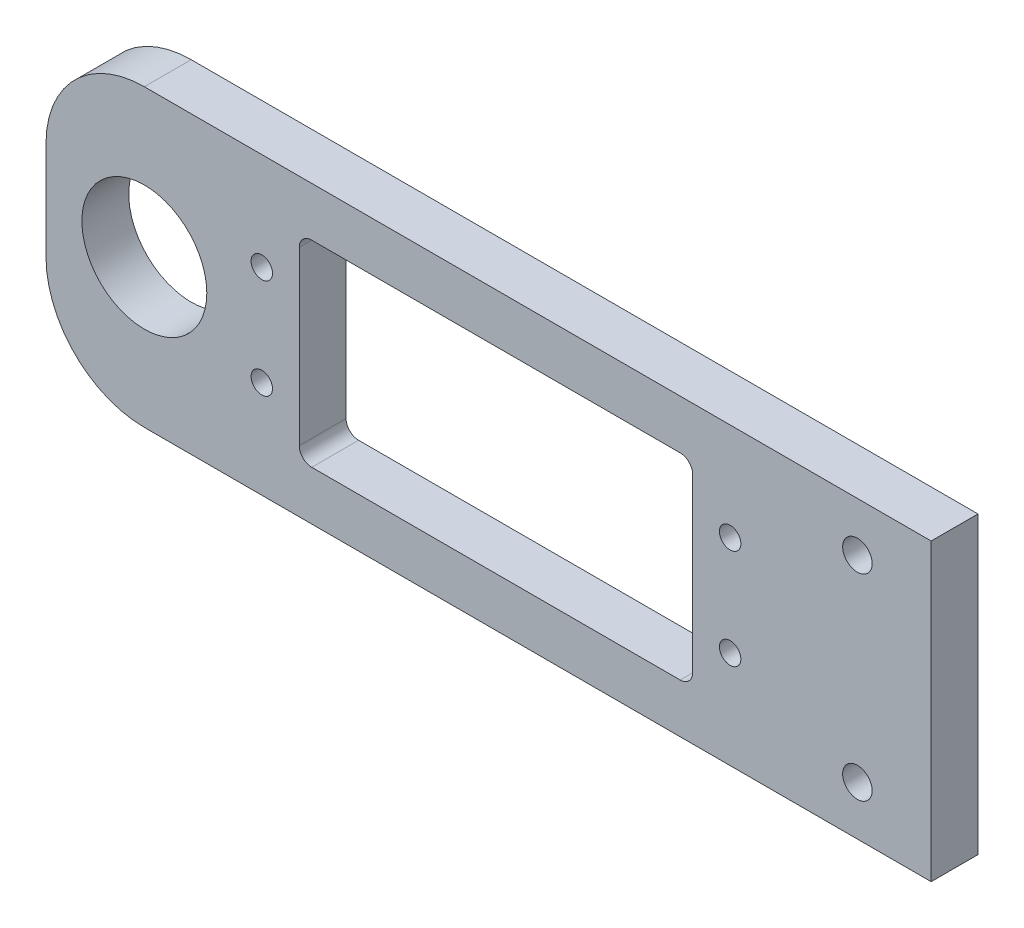
ISO-10303-21;
HEADER;
FILE_DESCRIPTION(('STEP AP214'),'2;1');
FILE_NAME('part.step','',(''),(''),'','','');
FILE_SCHEMA(('AUTOMOTIVE_DESIGN { 1 0 10303 214 1 1 1 1 }'));
ENDSEC;
DATA;
#1=APPLICATION_CONTEXT('core data for automotive mechanical design processes');
#2=APPLICATION_PROTOCOL_DEFINITION('international standard','automotive_design',2000,#1);
#3=PRODUCT_CONTEXT('',#1,'mechanical');
#4=PRODUCT('Part','Part','',(#3));
#5=PRODUCT_RELATED_PRODUCT_CATEGORY('part','',(#4));
#6=PRODUCT_DEFINITION_FORMATION('','',#4);
#7=PRODUCT_DEFINITION_CONTEXT('part definition',#1,'design');
#8=PRODUCT_DEFINITION('design','',#6,#7);
#9=PRODUCT_DEFINITION_SHAPE('','',#8);
#10=(LENGTH_UNIT() NAMED_UNIT(*) SI_UNIT(.MILLI.,.METRE.));
#11=(NAMED_UNIT(*) PLANE_ANGLE_UNIT() SI_UNIT($,.RADIAN.));
#12=(NAMED_UNIT(*) SI_UNIT($,.STERADIAN.) SOLID_ANGLE_UNIT());
#13=UNCERTAINTY_MEASURE_WITH_UNIT(LENGTH_MEASURE(1.E-05),#10,'distance_accuracy_value','');
#14=(GEOMETRIC_REPRESENTATION_CONTEXT(3) GLOBAL_UNCERTAINTY_ASSIGNED_CONTEXT((#13)) GLOBAL_UNIT_ASSIGNED_CONTEXT((#10,
#11,#12)) REPRESENTATION_CONTEXT('',''));
#15=CARTESIAN_POINT('',(0.,0.,0.));
#16=DIRECTION('',(0.,0.,1.));
#17=DIRECTION('',(1.,0.,0.));
#18=AXIS2_PLACEMENT_3D('',#15,#16,#17);
#19=CARTESIAN_POINT('',(45.,15.,4.7625));
#20=DIRECTION('',(-1.,0.,0.));
#21=DIRECTION('',(0.,-1.,0.));
#22=AXIS2_PLACEMENT_3D('',#19,#20,#21);
#23=PLANE('',#22);
#24=DIRECTION('',(0.,1.,0.));
#25=VECTOR('',#24,1.);
#26=CARTESIAN_POINT('',(45.,15.,0.));
#27=LINE('',#26,#25);
#28=CARTESIAN_POINT('',(45.,-15.,0.));
#29=VERTEX_POINT('',#28);
#30=CARTESIAN_POINT('',(45.,15.,0.));
#31=VERTEX_POINT('',#30);
#32=EDGE_CURVE('E161',#29,#31,#27,.T.);
#33=ORIENTED_EDGE('',*,*,#32,.T.);
#34=DIRECTION('',(0.,0.,-1.));
#35=VECTOR('',#34,1.);
#36=CARTESIAN_POINT('',(45.,15.,4.7625));
#37=LINE('',#36,#35);
#38=CARTESIAN_POINT('',(45.,15.,4.7625));
#39=VERTEX_POINT('',#38);
#40=EDGE_CURVE('E141',#39,#31,#37,.T.);
#41=ORIENTED_EDGE('',*,*,#40,.F.);
#42=DIRECTION('',(0.,1.,0.));
#43=VECTOR('',#42,1.);
#44=CARTESIAN_POINT('',(45.,15.,4.7625));
#45=LINE('',#44,#43);
#46=CARTESIAN_POINT('',(45.,-15.,4.7625));
#47=VERTEX_POINT('',#46);
#48=EDGE_CURVE('E148',#47,#39,#45,.T.);
#49=ORIENTED_EDGE('',*,*,#48,.F.);
#50=DIRECTION('',(0.,0.,-1.));
#51=VECTOR('',#50,1.);
#52=CARTESIAN_POINT('',(45.,-15.,4.7625));
#53=LINE('',#52,#51);
#54=EDGE_CURVE('E163',#47,#29,#53,.T.);
#55=ORIENTED_EDGE('',*,*,#54,.T.);
#56=EDGE_LOOP('',(#33,#41,#49,#55));
#57=FACE_BOUND('',#56,.T.);
#58=ADVANCED_FACE('F35',(#57),#23,.F.);
#59=CARTESIAN_POINT('',(-45.,15.,4.7625));
#60=DIRECTION('',(0.,-1.,0.));
#61=DIRECTION('',(0.,0.,-1.));
#62=AXIS2_PLACEMENT_3D('',#59,#60,#61);
#63=PLANE('',#62);
#64=DIRECTION('',(-1.,0.,0.));
#65=VECTOR('',#64,1.);
#66=CARTESIAN_POINT('',(-45.,15.,0.));
#67=LINE('',#66,#65);
#68=CARTESIAN_POINT('',(-35.,15.,0.));
#69=VERTEX_POINT('',#68);
#70=EDGE_CURVE('E306',#31,#69,#67,.T.);
#71=ORIENTED_EDGE('',*,*,#70,.T.);
#72=DIRECTION('',(0.,0.,-1.));
#73=VECTOR('',#72,1.);
#74=CARTESIAN_POINT('',(-35.,15.,4.7625));
#75=LINE('',#74,#73);
#76=CARTESIAN_POINT('',(-35.,15.,4.7625));
#77=VERTEX_POINT('',#76);
#78=EDGE_CURVE('E144',#69,#77,#75,.F.);
#79=ORIENTED_EDGE('',*,*,#78,.T.);
#80=DIRECTION('',(-1.,0.,0.));
#81=VECTOR('',#80,1.);
#82=CARTESIAN_POINT('',(-45.,15.,4.7625));
#83=LINE('',#82,#81);
#84=EDGE_CURVE('E136',#39,#77,#83,.T.);
#85=ORIENTED_EDGE('',*,*,#84,.F.);
#86=ORIENTED_EDGE('',*,*,#40,.T.);
#87=EDGE_LOOP('',(#71,#79,#85,#86));
#88=FACE_BOUND('',#87,.T.);
#89=ADVANCED_FACE('F139',(#88),#63,.F.);
#90=CARTESIAN_POINT('',(-45.,15.,4.7625));
#91=DIRECTION('',(1.,0.,0.));
#92=DIRECTION('',(0.,0.,-1.));
#93=AXIS2_PLACEMENT_3D('',#90,#91,#92);
#94=PLANE('',#93);
#95=DIRECTION('',(0.,-1.,0.));
#96=VECTOR('',#95,1.);
#97=CARTESIAN_POINT('',(-45.,15.,0.));
#98=LINE('',#97,#96);
#99=CARTESIAN_POINT('',(-45.,5.,0.));
#100=VERTEX_POINT('',#99);
#101=CARTESIAN_POINT('',(-45.,-5.,0.));
#102=VERTEX_POINT('',#101);
#103=EDGE_CURVE('E308',#100,#102,#98,.T.);
#104=ORIENTED_EDGE('',*,*,#103,.T.);
#105=DIRECTION('',(0.,0.,-1.));
#106=VECTOR('',#105,1.);
#107=CARTESIAN_POINT('',(-45.,-5.,4.7625));
#108=LINE('',#107,#106);
#109=CARTESIAN_POINT('',(-45.,-5.,4.7625));
#110=VERTEX_POINT('',#109);
#111=EDGE_CURVE('E177',#102,#110,#108,.F.);
#112=ORIENTED_EDGE('',*,*,#111,.T.);
#113=DIRECTION('',(0.,-1.,0.));
#114=VECTOR('',#113,1.);
#115=CARTESIAN_POINT('',(-45.,15.,4.7625));
#116=LINE('',#115,#114);
#117=CARTESIAN_POINT('',(-45.,5.,4.7625));
#118=VERTEX_POINT('',#117);
#119=EDGE_CURVE('E147',#118,#110,#116,.T.);
#120=ORIENTED_EDGE('',*,*,#119,.F.);
#121=DIRECTION('',(0.,0.,-1.));
#122=VECTOR('',#121,1.);
#123=CARTESIAN_POINT('',(-45.,5.,4.7625));
#124=LINE('',#123,#122);
#125=EDGE_CURVE('E174',#118,#100,#124,.T.);
#126=ORIENTED_EDGE('',*,*,#125,.T.);
#127=EDGE_LOOP('',(#104,#112,#120,#126));
#128=FACE_BOUND('',#127,.T.);
#129=ADVANCED_FACE('F250',(#128),#94,.F.);
#130=CARTESIAN_POINT('',(-45.,-15.,4.7625));
#131=DIRECTION('',(0.,1.,0.));
#132=DIRECTION('',(0.,0.,1.));
#133=AXIS2_PLACEMENT_3D('',#130,#131,#132);
#134=PLANE('',#133);
#135=DIRECTION('',(1.,0.,0.));
#136=VECTOR('',#135,1.);
#137=CARTESIAN_POINT('',(-45.,-15.,4.7625));
#138=LINE('',#137,#136);
#139=CARTESIAN_POINT('',(-35.,-15.,4.7625));
#140=VERTEX_POINT('',#139);
#141=EDGE_CURVE('E154',#140,#47,#138,.T.);
#142=ORIENTED_EDGE('',*,*,#141,.F.);
#143=DIRECTION('',(0.,0.,-1.));
#144=VECTOR('',#143,1.);
#145=CARTESIAN_POINT('',(-35.,-15.,4.7625));
#146=LINE('',#145,#144);
#147=CARTESIAN_POINT('',(-35.,-15.,0.));
#148=VERTEX_POINT('',#147);
#149=EDGE_CURVE('E162',#140,#148,#146,.T.);
#150=ORIENTED_EDGE('',*,*,#149,.T.);
#151=DIRECTION('',(1.,0.,0.));
#152=VECTOR('',#151,1.);
#153=CARTESIAN_POINT('',(-45.,-15.,0.));
#154=LINE('',#153,#152);
#155=EDGE_CURVE('E158',#148,#29,#154,.T.);
#156=ORIENTED_EDGE('',*,*,#155,.T.);
#157=ORIENTED_EDGE('',*,*,#54,.F.);
#158=EDGE_LOOP('',(#142,#150,#156,#157));
#159=FACE_BOUND('',#158,.T.);
#160=ADVANCED_FACE('F312',(#159),#134,.F.);
#161=CARTESIAN_POINT('',(0.,0.,4.7625));
#162=DIRECTION('',(0.,0.,1.));
#163=DIRECTION('',(1.,0.,0.));
#164=AXIS2_PLACEMENT_3D('',#161,#162,#163);
#165=PLANE('',#164);
#166=CARTESIAN_POINT('',(37.5,10.,4.7625));
#167=DIRECTION('',(0.,0.,1.));
#168=DIRECTION('',(1.,0.,0.));
#169=AXIS2_PLACEMENT_3D('',#166,#167,#168);
#170=CIRCLE('',#169,1.5);
#171=CARTESIAN_POINT('',(39.,10.,4.7625));
#172=VERTEX_POINT('',#171);
#173=EDGE_CURVE('E371',#172,#172,#170,.T.);
#174=ORIENTED_EDGE('',*,*,#173,.F.);
#175=EDGE_LOOP('',(#174));
#176=FACE_BOUND('',#175,.T.);
#177=CARTESIAN_POINT('',(37.5,-10.,4.7625));
#178=DIRECTION('',(0.,0.,1.));
#179=DIRECTION('',(-1.,0.,0.));
#180=AXIS2_PLACEMENT_3D('',#177,#178,#179);
#181=CIRCLE('',#180,1.5);
#182=CARTESIAN_POINT('',(36.,-10.,4.7625));
#183=VERTEX_POINT('',#182);
#184=EDGE_CURVE('E383',#183,#183,#181,.T.);
#185=ORIENTED_EDGE('',*,*,#184,.F.);
#186=EDGE_LOOP('',(#185));
#187=FACE_BOUND('',#186,.T.);
#188=CARTESIAN_POINT('',(24.56,5.08000000000001,4.7625));
#189=DIRECTION('',(0.,0.,1.));
#190=DIRECTION('',(-1.,0.,0.));
#191=AXIS2_PLACEMENT_3D('',#188,#189,#190);
#192=CIRCLE('',#191,1.09);
#193=CARTESIAN_POINT('',(23.47,5.08000000000001,4.7625));
#194=VERTEX_POINT('',#193);
#195=EDGE_CURVE('E375',#194,#194,#192,.T.);
#196=ORIENTED_EDGE('',*,*,#195,.F.);
#197=EDGE_LOOP('',(#196));
#198=FACE_BOUND('',#197,.T.);
#199=CARTESIAN_POINT('',(24.56,-5.07999999999999,4.7625));
#200=DIRECTION('',(0.,0.,1.));
#201=DIRECTION('',(1.,0.,0.));
#202=AXIS2_PLACEMENT_3D('',#199,#200,#201);
#203=CIRCLE('',#202,1.09);
#204=CARTESIAN_POINT('',(25.65,-5.07999999999999,4.7625));
#205=VERTEX_POINT('',#204);
#206=EDGE_CURVE('E395',#205,#205,#203,.T.);
#207=ORIENTED_EDGE('',*,*,#206,.F.);
#208=EDGE_LOOP('',(#207));
#209=FACE_BOUND('',#208,.T.);
#210=CARTESIAN_POINT('',(-23.06,-5.08,4.7625));
#211=DIRECTION('',(0.,0.,1.));
#212=DIRECTION('',(-1.,0.,0.));
#213=AXIS2_PLACEMENT_3D('',#210,#211,#212);
#214=CIRCLE('',#213,1.09);
#215=CARTESIAN_POINT('',(-24.15,-5.08,4.7625));
#216=VERTEX_POINT('',#215);
#217=EDGE_CURVE('E388',#216,#216,#214,.T.);
#218=ORIENTED_EDGE('',*,*,#217,.F.);
#219=EDGE_LOOP('',(#218));
#220=FACE_BOUND('',#219,.T.);
#221=CARTESIAN_POINT('',(-23.06,5.08,4.7625));
#222=DIRECTION('',(0.,0.,1.));
#223=DIRECTION('',(1.,0.,0.));
#224=AXIS2_PLACEMENT_3D('',#221,#222,#223);
#225=CIRCLE('',#224,1.09);
#226=CARTESIAN_POINT('',(-21.97,5.08,4.7625));
#227=VERTEX_POINT('',#226);
#228=EDGE_CURVE('E284',#227,#227,#225,.T.);
#229=ORIENTED_EDGE('',*,*,#228,.F.);
#230=EDGE_LOOP('',(#229));
#231=FACE_BOUND('',#230,.T.);
#232=DIRECTION('',(0.,-1.,0.));
#233=VECTOR('',#232,1.);
#234=CARTESIAN_POINT('',(-19.25,10.,4.7625));
#235=LINE('',#234,#233);
#236=CARTESIAN_POINT('',(-19.25,8.73,4.7625));
#237=VERTEX_POINT('',#236);
#238=CARTESIAN_POINT('',(-19.25,-8.73,4.7625));
#239=VERTEX_POINT('',#238);
#240=EDGE_CURVE('E290',#237,#239,#235,.T.);
#241=ORIENTED_EDGE('',*,*,#240,.F.);
#242=CARTESIAN_POINT('',(-17.98,8.73,4.7625));
#243=DIRECTION('',(0.,0.,1.));
#244=DIRECTION('',(1.,0.,0.));
#245=AXIS2_PLACEMENT_3D('',#242,#243,#244);
#246=CIRCLE('',#245,1.27);
#247=CARTESIAN_POINT('',(-17.98,10.,4.7625));
#248=VERTEX_POINT('',#247);
#249=EDGE_CURVE('E43',#237,#248,#246,.F.);
#250=ORIENTED_EDGE('',*,*,#249,.T.);
#251=DIRECTION('',(-1.,0.,0.));
#252=VECTOR('',#251,1.);
#253=CARTESIAN_POINT('',(-19.25,10.,4.7625));
#254=LINE('',#253,#252);
#255=CARTESIAN_POINT('',(19.48,10.,4.7625));
#256=VERTEX_POINT('',#255);
#257=EDGE_CURVE('E298',#256,#248,#254,.T.);
#258=ORIENTED_EDGE('',*,*,#257,.F.);
#259=CARTESIAN_POINT('',(19.48,8.73,4.7625));
#260=DIRECTION('',(0.,0.,1.));
#261=DIRECTION('',(1.,0.,0.));
#262=AXIS2_PLACEMENT_3D('',#259,#260,#261);
#263=CIRCLE('',#262,1.27);
#264=CARTESIAN_POINT('',(20.75,8.73,4.7625));
#265=VERTEX_POINT('',#264);
#266=EDGE_CURVE('E57',#256,#265,#263,.F.);
#267=ORIENTED_EDGE('',*,*,#266,.T.);
#268=DIRECTION('',(0.,1.,0.));
#269=VECTOR('',#268,1.);
#270=CARTESIAN_POINT('',(20.75,10.,4.7625));
#271=LINE('',#270,#269);
#272=CARTESIAN_POINT('',(20.75,-8.73,4.7625));
#273=VERTEX_POINT('',#272);
#274=EDGE_CURVE('E296',#273,#265,#271,.T.);
#275=ORIENTED_EDGE('',*,*,#274,.F.);
#276=CARTESIAN_POINT('',(19.48,-8.73,4.7625));
#277=DIRECTION('',(0.,0.,1.));
#278=DIRECTION('',(1.,0.,0.));
#279=AXIS2_PLACEMENT_3D('',#276,#277,#278);
#280=CIRCLE('',#279,1.27);
#281=CARTESIAN_POINT('',(19.48,-10.,4.7625));
#282=VERTEX_POINT('',#281);
#283=EDGE_CURVE('E207',#273,#282,#280,.F.);
#284=ORIENTED_EDGE('',*,*,#283,.T.);
#285=DIRECTION('',(1.,0.,0.));
#286=VECTOR('',#285,1.);
#287=CARTESIAN_POINT('',(-19.25,-10.,4.7625));
#288=LINE('',#287,#286);
#289=CARTESIAN_POINT('',(-17.98,-10.,4.7625));
#290=VERTEX_POINT('',#289);
#291=EDGE_CURVE('E293',#290,#282,#288,.T.);
#292=ORIENTED_EDGE('',*,*,#291,.F.);
#293=CARTESIAN_POINT('',(-17.98,-8.73,4.7625));
#294=DIRECTION('',(0.,0.,1.));
#295=DIRECTION('',(1.,0.,0.));
#296=AXIS2_PLACEMENT_3D('',#293,#294,#295);
#297=CIRCLE('',#296,1.27);
#298=EDGE_CURVE('E211',#290,#239,#297,.F.);
#299=ORIENTED_EDGE('',*,*,#298,.T.);
#300=EDGE_LOOP('',(#241,#250,#258,#267,#275,#284,#292,#299));
#301=FACE_BOUND('',#300,.T.);
#302=CARTESIAN_POINT('',(-35.,0.,4.7625));
#303=DIRECTION('',(0.,0.,1.));
#304=DIRECTION('',(1.,0.,0.));
#305=AXIS2_PLACEMENT_3D('',#302,#303,#304);
#306=CIRCLE('',#305,6.35);
#307=CARTESIAN_POINT('',(-28.65,0.,4.7625));
#308=VERTEX_POINT('',#307);
#309=EDGE_CURVE('E188',#308,#308,#306,.T.);
#310=ORIENTED_EDGE('',*,*,#309,.F.);
#311=EDGE_LOOP('',(#310));
#312=FACE_BOUND('',#311,.T.);
#313=ORIENTED_EDGE('',*,*,#119,.T.);
#314=CARTESIAN_POINT('',(-35.,-5.,4.7625));
#315=DIRECTION('',(0.,0.,1.));
#316=DIRECTION('',(1.,0.,0.));
#317=AXIS2_PLACEMENT_3D('',#314,#315,#316);
#318=CIRCLE('',#317,10.);
#319=EDGE_CURVE('E181',#110,#140,#318,.T.);
#320=ORIENTED_EDGE('',*,*,#319,.T.);
#321=ORIENTED_EDGE('',*,*,#141,.T.);
#322=ORIENTED_EDGE('',*,*,#48,.T.);
#323=ORIENTED_EDGE('',*,*,#84,.T.);
#324=CARTESIAN_POINT('',(-35.,5.,4.7625));
#325=DIRECTION('',(0.,0.,1.));
#326=DIRECTION('',(1.,0.,0.));
#327=AXIS2_PLACEMENT_3D('',#324,#325,#326);
#328=CIRCLE('',#327,10.);
#329=EDGE_CURVE('E179',#77,#118,#328,.T.);
#330=ORIENTED_EDGE('',*,*,#329,.T.);
#331=EDGE_LOOP('',(#313,#320,#321,#322,#323,#330));
#332=FACE_BOUND('',#331,.T.);
#333=ADVANCED_FACE('F152',(#176,#187,#198,#209,#220,#231,#301,#312,#332),#165,.T.);
#334=CARTESIAN_POINT('',(0.,0.,0.));
#335=DIRECTION('',(0.,0.,1.));
#336=DIRECTION('',(1.,0.,0.));
#337=AXIS2_PLACEMENT_3D('',#334,#335,#336);
#338=PLANE('',#337);
#339=CARTESIAN_POINT('',(37.5,10.,0.));
#340=DIRECTION('',(0.,0.,1.));
#341=DIRECTION('',(1.,0.,0.));
#342=AXIS2_PLACEMENT_3D('',#339,#340,#341);
#343=CIRCLE('',#342,1.5);
#344=CARTESIAN_POINT('',(39.,10.,0.));
#345=VERTEX_POINT('',#344);
#346=EDGE_CURVE('E374',#345,#345,#343,.F.);
#347=ORIENTED_EDGE('',*,*,#346,.F.);
#348=EDGE_LOOP('',(#347));
#349=FACE_BOUND('',#348,.T.);
#350=CARTESIAN_POINT('',(37.5,-10.,0.));
#351=DIRECTION('',(0.,0.,1.));
#352=DIRECTION('',(1.,0.,0.));
#353=AXIS2_PLACEMENT_3D('',#350,#351,#352);
#354=CIRCLE('',#353,1.5);
#355=CARTESIAN_POINT('',(39.,-10.,0.));
#356=VERTEX_POINT('',#355);
#357=EDGE_CURVE('E380',#356,#356,#354,.F.);
#358=ORIENTED_EDGE('',*,*,#357,.F.);
#359=EDGE_LOOP('',(#358));
#360=FACE_BOUND('',#359,.T.);
#361=CARTESIAN_POINT('',(24.56,5.08000000000001,0.));
#362=DIRECTION('',(0.,0.,1.));
#363=DIRECTION('',(1.,0.,0.));
#364=AXIS2_PLACEMENT_3D('',#361,#362,#363);
#365=CIRCLE('',#364,1.09);
#366=CARTESIAN_POINT('',(25.65,5.08000000000001,0.));
#367=VERTEX_POINT('',#366);
#368=EDGE_CURVE('E378',#367,#367,#365,.F.);
#369=ORIENTED_EDGE('',*,*,#368,.F.);
#370=EDGE_LOOP('',(#369));
#371=FACE_BOUND('',#370,.T.);
#372=CARTESIAN_POINT('',(24.56,-5.07999999999999,0.));
#373=DIRECTION('',(0.,0.,1.));
#374=DIRECTION('',(1.,0.,0.));
#375=AXIS2_PLACEMENT_3D('',#372,#373,#374);
#376=CIRCLE('',#375,1.09);
#377=CARTESIAN_POINT('',(25.65,-5.07999999999999,0.));
#378=VERTEX_POINT('',#377);
#379=EDGE_CURVE('E392',#378,#378,#376,.F.);
#380=ORIENTED_EDGE('',*,*,#379,.F.);
#381=EDGE_LOOP('',(#380));
#382=FACE_BOUND('',#381,.T.);
#383=CARTESIAN_POINT('',(-23.06,-5.08,0.));
#384=DIRECTION('',(0.,0.,1.));
#385=DIRECTION('',(1.,0.,0.));
#386=AXIS2_PLACEMENT_3D('',#383,#384,#385);
#387=CIRCLE('',#386,1.09);
#388=CARTESIAN_POINT('',(-21.97,-5.08,0.));
#389=VERTEX_POINT('',#388);
#390=EDGE_CURVE('E391',#389,#389,#387,.F.);
#391=ORIENTED_EDGE('',*,*,#390,.F.);
#392=EDGE_LOOP('',(#391));
#393=FACE_BOUND('',#392,.T.);
#394=CARTESIAN_POINT('',(-23.06,5.08,0.));
#395=DIRECTION('',(0.,0.,1.));
#396=DIRECTION('',(1.,0.,0.));
#397=AXIS2_PLACEMENT_3D('',#394,#395,#396);
#398=CIRCLE('',#397,1.09);
#399=CARTESIAN_POINT('',(-21.97,5.08,0.));
#400=VERTEX_POINT('',#399);
#401=EDGE_CURVE('E281',#400,#400,#398,.F.);
#402=ORIENTED_EDGE('',*,*,#401,.F.);
#403=EDGE_LOOP('',(#402));
#404=FACE_BOUND('',#403,.T.);
#405=DIRECTION('',(1.,0.,0.));
#406=VECTOR('',#405,1.);
#407=CARTESIAN_POINT('',(-19.25,10.,0.));
#408=LINE('',#407,#406);
#409=CARTESIAN_POINT('',(-17.98,10.,0.));
#410=VERTEX_POINT('',#409);
#411=CARTESIAN_POINT('',(19.48,10.,0.));
#412=VERTEX_POINT('',#411);
#413=EDGE_CURVE('E224',#410,#412,#408,.T.);
#414=ORIENTED_EDGE('',*,*,#413,.F.);
#415=CARTESIAN_POINT('',(-17.98,8.73,0.));
#416=DIRECTION('',(0.,0.,1.));
#417=DIRECTION('',(1.,0.,0.));
#418=AXIS2_PLACEMENT_3D('',#415,#416,#417);
#419=CIRCLE('',#418,1.27);
#420=CARTESIAN_POINT('',(-19.25,8.73,0.));
#421=VERTEX_POINT('',#420);
#422=EDGE_CURVE('E11',#410,#421,#419,.T.);
#423=ORIENTED_EDGE('',*,*,#422,.T.);
#424=DIRECTION('',(0.,1.,0.));
#425=VECTOR('',#424,1.);
#426=CARTESIAN_POINT('',(-19.25,10.,0.));
#427=LINE('',#426,#425);
#428=CARTESIAN_POINT('',(-19.25,-8.73,0.));
#429=VERTEX_POINT('',#428);
#430=EDGE_CURVE('E231',#429,#421,#427,.T.);
#431=ORIENTED_EDGE('',*,*,#430,.F.);
#432=CARTESIAN_POINT('',(-17.98,-8.73,0.));
#433=DIRECTION('',(0.,0.,1.));
#434=DIRECTION('',(1.,0.,0.));
#435=AXIS2_PLACEMENT_3D('',#432,#433,#434);
#436=CIRCLE('',#435,1.27);
#437=CARTESIAN_POINT('',(-17.98,-10.,0.));
#438=VERTEX_POINT('',#437);
#439=EDGE_CURVE('E213',#429,#438,#436,.T.);
#440=ORIENTED_EDGE('',*,*,#439,.T.);
#441=DIRECTION('',(-1.,0.,0.));
#442=VECTOR('',#441,1.);
#443=CARTESIAN_POINT('',(-19.25,-10.,0.));
#444=LINE('',#443,#442);
#445=CARTESIAN_POINT('',(19.48,-10.,0.));
#446=VERTEX_POINT('',#445);
#447=EDGE_CURVE('E277',#446,#438,#444,.T.);
#448=ORIENTED_EDGE('',*,*,#447,.F.);
#449=CARTESIAN_POINT('',(19.48,-8.73,0.));
#450=DIRECTION('',(0.,0.,1.));
#451=DIRECTION('',(1.,0.,0.));
#452=AXIS2_PLACEMENT_3D('',#449,#450,#451);
#453=CIRCLE('',#452,1.27);
#454=CARTESIAN_POINT('',(20.75,-8.73,0.));
#455=VERTEX_POINT('',#454);
#456=EDGE_CURVE('E209',#446,#455,#453,.T.);
#457=ORIENTED_EDGE('',*,*,#456,.T.);
#458=DIRECTION('',(0.,-1.,0.));
#459=VECTOR('',#458,1.);
#460=CARTESIAN_POINT('',(20.75,10.,0.));
#461=LINE('',#460,#459);
#462=CARTESIAN_POINT('',(20.75,8.73,0.));
#463=VERTEX_POINT('',#462);
#464=EDGE_CURVE('E227',#463,#455,#461,.T.);
#465=ORIENTED_EDGE('',*,*,#464,.F.);
#466=CARTESIAN_POINT('',(19.48,8.73,0.));
#467=DIRECTION('',(0.,0.,1.));
#468=DIRECTION('',(1.,0.,0.));
#469=AXIS2_PLACEMENT_3D('',#466,#467,#468);
#470=CIRCLE('',#469,1.27);
#471=EDGE_CURVE('E216',#463,#412,#470,.T.);
#472=ORIENTED_EDGE('',*,*,#471,.T.);
#473=EDGE_LOOP('',(#414,#423,#431,#440,#448,#457,#465,#472));
#474=FACE_BOUND('',#473,.T.);
#475=CARTESIAN_POINT('',(-35.,0.,0.));
#476=DIRECTION('',(0.,0.,1.));
#477=DIRECTION('',(1.,0.,0.));
#478=AXIS2_PLACEMENT_3D('',#475,#476,#477);
#479=CIRCLE('',#478,6.35);
#480=CARTESIAN_POINT('',(-28.65,0.,0.));
#481=VERTEX_POINT('',#480);
#482=EDGE_CURVE('E185',#481,#481,#479,.T.);
#483=ORIENTED_EDGE('',*,*,#482,.T.);
#484=EDGE_LOOP('',(#483));
#485=FACE_BOUND('',#484,.T.);
#486=ORIENTED_EDGE('',*,*,#155,.F.);
#487=CARTESIAN_POINT('',(-35.,-5.,0.));
#488=DIRECTION('',(0.,0.,1.));
#489=DIRECTION('',(1.,0.,0.));
#490=AXIS2_PLACEMENT_3D('',#487,#488,#489);
#491=CIRCLE('',#490,10.);
#492=EDGE_CURVE('E172',#148,#102,#491,.F.);
#493=ORIENTED_EDGE('',*,*,#492,.T.);
#494=ORIENTED_EDGE('',*,*,#103,.F.);
#495=CARTESIAN_POINT('',(-35.,5.,0.));
#496=DIRECTION('',(0.,0.,1.));
#497=DIRECTION('',(1.,0.,0.));
#498=AXIS2_PLACEMENT_3D('',#495,#496,#497);
#499=CIRCLE('',#498,10.);
#500=EDGE_CURVE('E166',#100,#69,#499,.F.);
#501=ORIENTED_EDGE('',*,*,#500,.T.);
#502=ORIENTED_EDGE('',*,*,#70,.F.);
#503=ORIENTED_EDGE('',*,*,#32,.F.);
#504=EDGE_LOOP('',(#486,#493,#494,#501,#502,#503));
#505=FACE_BOUND('',#504,.T.);
#506=ADVANCED_FACE('F222',(#349,#360,#371,#382,#393,#404,#474,#485,#505),#338,.F.);
#507=CARTESIAN_POINT('',(-35.,-5.,4.7625));
#508=DIRECTION('',(0.,0.,-1.));
#509=DIRECTION('',(-1.,0.,0.));
#510=AXIS2_PLACEMENT_3D('',#507,#508,#509);
#511=CYLINDRICAL_SURFACE('',#510,10.);
#512=ORIENTED_EDGE('',*,*,#319,.F.);
#513=ORIENTED_EDGE('',*,*,#111,.F.);
#514=ORIENTED_EDGE('',*,*,#492,.F.);
#515=ORIENTED_EDGE('',*,*,#149,.F.);
#516=EDGE_LOOP('',(#512,#513,#514,#515));
#517=FACE_BOUND('',#516,.T.);
#518=ADVANCED_FACE('F254',(#517),#511,.T.);
#519=CARTESIAN_POINT('',(-35.,5.,4.7625));
#520=DIRECTION('',(0.,0.,-1.));
#521=DIRECTION('',(-1.,0.,0.));
#522=AXIS2_PLACEMENT_3D('',#519,#520,#521);
#523=CYLINDRICAL_SURFACE('',#522,10.);
#524=ORIENTED_EDGE('',*,*,#329,.F.);
#525=ORIENTED_EDGE('',*,*,#78,.F.);
#526=ORIENTED_EDGE('',*,*,#500,.F.);
#527=ORIENTED_EDGE('',*,*,#125,.F.);
#528=EDGE_LOOP('',(#524,#525,#526,#527));
#529=FACE_BOUND('',#528,.T.);
#530=ADVANCED_FACE('F257',(#529),#523,.T.);
#531=CARTESIAN_POINT('',(-35.,0.,-1.2375));
#532=DIRECTION('',(0.,0.,1.));
#533=DIRECTION('',(1.,0.,0.));
#534=AXIS2_PLACEMENT_3D('',#531,#532,#533);
#535=CYLINDRICAL_SURFACE('',#534,6.35);
#536=ORIENTED_EDGE('',*,*,#309,.T.);
#537=EDGE_LOOP('',(#536));
#538=FACE_BOUND('',#537,.T.);
#539=ORIENTED_EDGE('',*,*,#482,.F.);
#540=EDGE_LOOP('',(#539));
#541=FACE_BOUND('',#540,.T.);
#542=ADVANCED_FACE('F261',(#538,#541),#535,.F.);
#543=CARTESIAN_POINT('',(-19.25,10.,-0.00100000000000013));
#544=DIRECTION('',(-1.,0.,0.));
#545=DIRECTION('',(0.,0.,1.));
#546=AXIS2_PLACEMENT_3D('',#543,#544,#545);
#547=PLANE('',#546);
#548=ORIENTED_EDGE('',*,*,#240,.T.);
#549=DIRECTION('',(0.,0.,1.));
#550=VECTOR('',#549,1.);
#551=CARTESIAN_POINT('',(-19.25,-8.73,0.));
#552=LINE('',#551,#550);
#553=EDGE_CURVE('E201',#239,#429,#552,.F.);
#554=ORIENTED_EDGE('',*,*,#553,.T.);
#555=ORIENTED_EDGE('',*,*,#430,.T.);
#556=DIRECTION('',(0.,0.,1.));
#557=VECTOR('',#556,1.);
#558=CARTESIAN_POINT('',(-19.25,8.73,4.7625));
#559=LINE('',#558,#557);
#560=EDGE_CURVE('E198',#421,#237,#559,.T.);
#561=ORIENTED_EDGE('',*,*,#560,.T.);
#562=EDGE_LOOP('',(#548,#554,#555,#561));
#563=FACE_BOUND('',#562,.T.);
#564=ADVANCED_FACE('F335',(#563),#547,.F.);
#565=CARTESIAN_POINT('',(-19.25,10.,-0.00100000000000013));
#566=DIRECTION('',(0.,1.,0.));
#567=DIRECTION('',(-1.,0.,0.));
#568=AXIS2_PLACEMENT_3D('',#565,#566,#567);
#569=PLANE('',#568);
#570=ORIENTED_EDGE('',*,*,#413,.T.);
#571=DIRECTION('',(0.,0.,1.));
#572=VECTOR('',#571,1.);
#573=CARTESIAN_POINT('',(19.48,10.,4.7625));
#574=LINE('',#573,#572);
#575=EDGE_CURVE('E205',#412,#256,#574,.T.);
#576=ORIENTED_EDGE('',*,*,#575,.T.);
#577=ORIENTED_EDGE('',*,*,#257,.T.);
#578=DIRECTION('',(0.,0.,1.));
#579=VECTOR('',#578,1.);
#580=CARTESIAN_POINT('',(-17.98,10.,0.));
#581=LINE('',#580,#579);
#582=EDGE_CURVE('E203',#248,#410,#581,.F.);
#583=ORIENTED_EDGE('',*,*,#582,.T.);
#584=EDGE_LOOP('',(#570,#576,#577,#583));
#585=FACE_BOUND('',#584,.T.);
#586=ADVANCED_FACE('F229',(#585),#569,.F.);
#587=CARTESIAN_POINT('',(20.75,10.,-0.00100000000000013));
#588=DIRECTION('',(1.,0.,0.));
#589=DIRECTION('',(0.,1.,0.));
#590=AXIS2_PLACEMENT_3D('',#587,#588,#589);
#591=PLANE('',#590);
#592=ORIENTED_EDGE('',*,*,#464,.T.);
#593=DIRECTION('',(0.,0.,1.));
#594=VECTOR('',#593,1.);
#595=CARTESIAN_POINT('',(20.75,-8.73,4.7625));
#596=LINE('',#595,#594);
#597=EDGE_CURVE('E190',#455,#273,#596,.T.);
#598=ORIENTED_EDGE('',*,*,#597,.T.);
#599=ORIENTED_EDGE('',*,*,#274,.T.);
#600=DIRECTION('',(0.,0.,1.));
#601=VECTOR('',#600,1.);
#602=CARTESIAN_POINT('',(20.75,8.73,0.));
#603=LINE('',#602,#601);
#604=EDGE_CURVE('E184',#265,#463,#603,.F.);
#605=ORIENTED_EDGE('',*,*,#604,.T.);
#606=EDGE_LOOP('',(#592,#598,#599,#605));
#607=FACE_BOUND('',#606,.T.);
#608=ADVANCED_FACE('F269',(#607),#591,.F.);
#609=CARTESIAN_POINT('',(-19.25,-10.,-0.00100000000000013));
#610=DIRECTION('',(0.,-1.,0.));
#611=DIRECTION('',(0.,0.,-1.));
#612=AXIS2_PLACEMENT_3D('',#609,#610,#611);
#613=PLANE('',#612);
#614=ORIENTED_EDGE('',*,*,#291,.T.);
#615=DIRECTION('',(0.,0.,1.));
#616=VECTOR('',#615,1.);
#617=CARTESIAN_POINT('',(19.48,-10.,0.));
#618=LINE('',#617,#616);
#619=EDGE_CURVE('E196',#282,#446,#618,.F.);
#620=ORIENTED_EDGE('',*,*,#619,.T.);
#621=ORIENTED_EDGE('',*,*,#447,.T.);
#622=DIRECTION('',(0.,0.,1.));
#623=VECTOR('',#622,1.);
#624=CARTESIAN_POINT('',(-17.98,-10.,4.7625));
#625=LINE('',#624,#623);
#626=EDGE_CURVE('E193',#438,#290,#625,.T.);
#627=ORIENTED_EDGE('',*,*,#626,.T.);
#628=EDGE_LOOP('',(#614,#620,#621,#627));
#629=FACE_BOUND('',#628,.T.);
#630=ADVANCED_FACE('F264',(#629),#613,.F.);
#631=CARTESIAN_POINT('',(19.48,-8.73,-0.00100000000000013));
#632=DIRECTION('',(0.,0.,-1.));
#633=DIRECTION('',(-1.,0.,0.));
#634=AXIS2_PLACEMENT_3D('',#631,#632,#633);
#635=CYLINDRICAL_SURFACE('',#634,1.27);
#636=ORIENTED_EDGE('',*,*,#456,.F.);
#637=ORIENTED_EDGE('',*,*,#619,.F.);
#638=ORIENTED_EDGE('',*,*,#283,.F.);
#639=ORIENTED_EDGE('',*,*,#597,.F.);
#640=EDGE_LOOP('',(#636,#637,#638,#639));
#641=FACE_BOUND('',#640,.T.);
#642=ADVANCED_FACE('F242',(#641),#635,.F.);
#643=CARTESIAN_POINT('',(-17.98,-8.73,-0.00100000000000013));
#644=DIRECTION('',(0.,0.,-1.));
#645=DIRECTION('',(-1.,0.,0.));
#646=AXIS2_PLACEMENT_3D('',#643,#644,#645);
#647=CYLINDRICAL_SURFACE('',#646,1.27);
#648=ORIENTED_EDGE('',*,*,#439,.F.);
#649=ORIENTED_EDGE('',*,*,#553,.F.);
#650=ORIENTED_EDGE('',*,*,#298,.F.);
#651=ORIENTED_EDGE('',*,*,#626,.F.);
#652=EDGE_LOOP('',(#648,#649,#650,#651));
#653=FACE_BOUND('',#652,.T.);
#654=ADVANCED_FACE('F235',(#653),#647,.F.);
#655=CARTESIAN_POINT('',(19.48,8.73,-0.00100000000000013));
#656=DIRECTION('',(0.,0.,-1.));
#657=DIRECTION('',(-1.,0.,0.));
#658=AXIS2_PLACEMENT_3D('',#655,#656,#657);
#659=CYLINDRICAL_SURFACE('',#658,1.27);
#660=ORIENTED_EDGE('',*,*,#471,.F.);
#661=ORIENTED_EDGE('',*,*,#604,.F.);
#662=ORIENTED_EDGE('',*,*,#266,.F.);
#663=ORIENTED_EDGE('',*,*,#575,.F.);
#664=EDGE_LOOP('',(#660,#661,#662,#663));
#665=FACE_BOUND('',#664,.T.);
#666=ADVANCED_FACE('F233',(#665),#659,.F.);
#667=CARTESIAN_POINT('',(-17.98,8.73,-0.00100000000000013));
#668=DIRECTION('',(0.,0.,-1.));
#669=DIRECTION('',(-1.,0.,0.));
#670=AXIS2_PLACEMENT_3D('',#667,#668,#669);
#671=CYLINDRICAL_SURFACE('',#670,1.27);
#672=ORIENTED_EDGE('',*,*,#422,.F.);
#673=ORIENTED_EDGE('',*,*,#582,.F.);
#674=ORIENTED_EDGE('',*,*,#249,.F.);
#675=ORIENTED_EDGE('',*,*,#560,.F.);
#676=EDGE_LOOP('',(#672,#673,#674,#675));
#677=FACE_BOUND('',#676,.T.);
#678=ADVANCED_FACE('F37',(#677),#671,.F.);
#679=CARTESIAN_POINT('',(-23.06,5.08,-0.00100000000000013));
#680=DIRECTION('',(0.,0.,1.));
#681=DIRECTION('',(1.,0.,0.));
#682=AXIS2_PLACEMENT_3D('',#679,#680,#681);
#683=CYLINDRICAL_SURFACE('',#682,1.09);
#684=ORIENTED_EDGE('',*,*,#228,.T.);
#685=EDGE_LOOP('',(#684));
#686=FACE_BOUND('',#685,.T.);
#687=ORIENTED_EDGE('',*,*,#401,.T.);
#688=EDGE_LOOP('',(#687));
#689=FACE_BOUND('',#688,.T.);
#690=ADVANCED_FACE('F240',(#686,#689),#683,.F.);
#691=CARTESIAN_POINT('',(-23.06,-5.08,-0.00100000000000013));
#692=DIRECTION('',(0.,0.,1.));
#693=DIRECTION('',(1.,0.,0.));
#694=AXIS2_PLACEMENT_3D('',#691,#692,#693);
#695=CYLINDRICAL_SURFACE('',#694,1.09);
#696=ORIENTED_EDGE('',*,*,#217,.T.);
#697=EDGE_LOOP('',(#696));
#698=FACE_BOUND('',#697,.T.);
#699=ORIENTED_EDGE('',*,*,#390,.T.);
#700=EDGE_LOOP('',(#699));
#701=FACE_BOUND('',#700,.T.);
#702=ADVANCED_FACE('F346',(#698,#701),#695,.F.);
#703=CARTESIAN_POINT('',(24.56,-5.07999999999999,-0.00100000000000013));
#704=DIRECTION('',(0.,0.,1.));
#705=DIRECTION('',(1.,0.,0.));
#706=AXIS2_PLACEMENT_3D('',#703,#704,#705);
#707=CYLINDRICAL_SURFACE('',#706,1.09);
#708=ORIENTED_EDGE('',*,*,#206,.T.);
#709=EDGE_LOOP('',(#708));
#710=FACE_BOUND('',#709,.T.);
#711=ORIENTED_EDGE('',*,*,#379,.T.);
#712=EDGE_LOOP('',(#711));
#713=FACE_BOUND('',#712,.T.);
#714=ADVANCED_FACE('F352',(#710,#713),#707,.F.);
#715=CARTESIAN_POINT('',(24.56,5.08000000000001,-0.00100000000000013));
#716=DIRECTION('',(0.,0.,1.));
#717=DIRECTION('',(1.,0.,0.));
#718=AXIS2_PLACEMENT_3D('',#715,#716,#717);
#719=CYLINDRICAL_SURFACE('',#718,1.09);
#720=ORIENTED_EDGE('',*,*,#195,.T.);
#721=EDGE_LOOP('',(#720));
#722=FACE_BOUND('',#721,.T.);
#723=ORIENTED_EDGE('',*,*,#368,.T.);
#724=EDGE_LOOP('',(#723));
#725=FACE_BOUND('',#724,.T.);
#726=ADVANCED_FACE('F348',(#722,#725),#719,.F.);
#727=CARTESIAN_POINT('',(37.5,-10.,-0.00100000000000013));
#728=DIRECTION('',(0.,0.,1.));
#729=DIRECTION('',(1.,0.,0.));
#730=AXIS2_PLACEMENT_3D('',#727,#728,#729);
#731=CYLINDRICAL_SURFACE('',#730,1.5);
#732=ORIENTED_EDGE('',*,*,#184,.T.);
#733=EDGE_LOOP('',(#732));
#734=FACE_BOUND('',#733,.T.);
#735=ORIENTED_EDGE('',*,*,#357,.T.);
#736=EDGE_LOOP('',(#735));
#737=FACE_BOUND('',#736,.T.);
#738=ADVANCED_FACE('F351',(#734,#737),#731,.F.);
#739=CARTESIAN_POINT('',(37.5,10.,-0.00100000000000013));
#740=DIRECTION('',(0.,0.,1.));
#741=DIRECTION('',(1.,0.,0.));
#742=AXIS2_PLACEMENT_3D('',#739,#740,#741);
#743=CYLINDRICAL_SURFACE('',#742,1.5);
#744=ORIENTED_EDGE('',*,*,#173,.T.);
#745=EDGE_LOOP('',(#744));
#746=FACE_BOUND('',#745,.T.);
#747=ORIENTED_EDGE('',*,*,#346,.T.);
#748=EDGE_LOOP('',(#747));
#749=FACE_BOUND('',#748,.T.);
#750=ADVANCED_FACE('F362',(#746,#749),#743,.F.);
#751=CLOSED_SHELL('',(#58,#89,#129,#160,#333,#506,#518,#530,#542,#564,#586,#608,#630,#642,#654,
#666,#678,#690,#702,#714,#726,#738,#750));
#752=MANIFOLD_SOLID_BREP('B2',#751);
#753=ADVANCED_BREP_SHAPE_REPRESENTATION('',(#18,#752),#14);
#754=SHAPE_DEFINITION_REPRESENTATION(#9,#753);
ENDSEC;
END-ISO-10303-21;
